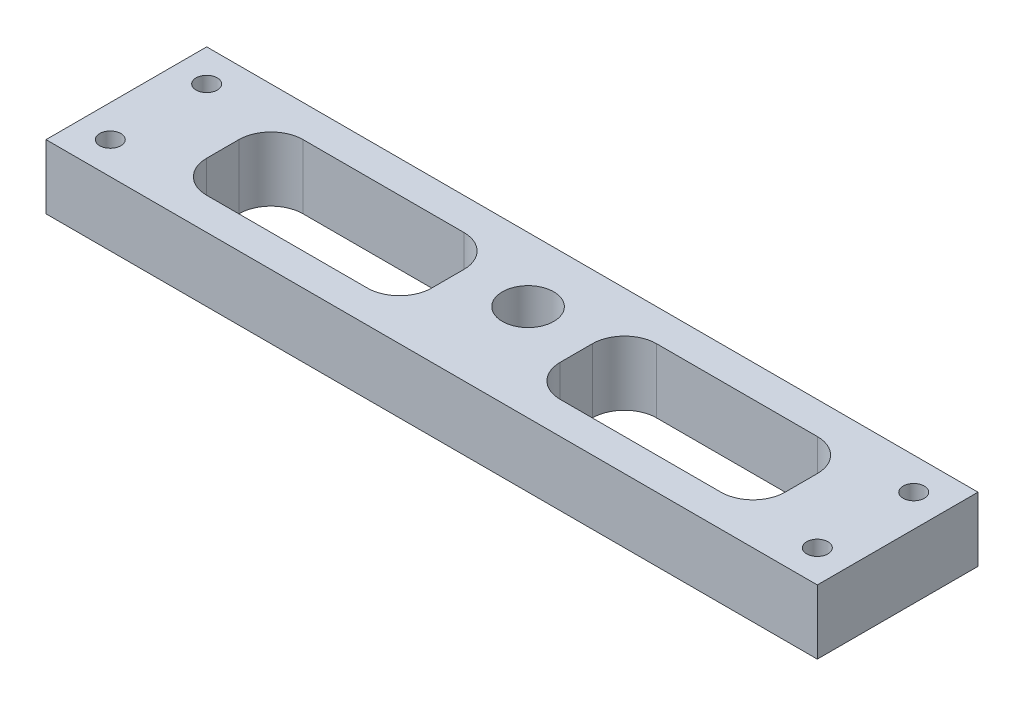
ISO-10303-21;
HEADER;
FILE_DESCRIPTION(('STEP AP214'),'2;1');
FILE_NAME('part.step','',(''),(''),'','','');
FILE_SCHEMA(('AUTOMOTIVE_DESIGN { 1 0 10303 214 1 1 1 1 }'));
ENDSEC;
DATA;
#1=APPLICATION_CONTEXT('core data for automotive mechanical design processes');
#2=APPLICATION_PROTOCOL_DEFINITION('international standard','automotive_design',2000,#1);
#3=PRODUCT_CONTEXT('',#1,'mechanical');
#4=PRODUCT('Part','Part','',(#3));
#5=PRODUCT_RELATED_PRODUCT_CATEGORY('part','',(#4));
#6=PRODUCT_DEFINITION_FORMATION('','',#4);
#7=PRODUCT_DEFINITION_CONTEXT('part definition',#1,'design');
#8=PRODUCT_DEFINITION('design','',#6,#7);
#9=PRODUCT_DEFINITION_SHAPE('','',#8);
#10=(LENGTH_UNIT() NAMED_UNIT(*) SI_UNIT(.MILLI.,.METRE.));
#11=(NAMED_UNIT(*) PLANE_ANGLE_UNIT() SI_UNIT($,.RADIAN.));
#12=(NAMED_UNIT(*) SI_UNIT($,.STERADIAN.) SOLID_ANGLE_UNIT());
#13=UNCERTAINTY_MEASURE_WITH_UNIT(LENGTH_MEASURE(1.E-05),#10,'distance_accuracy_value','');
#14=(GEOMETRIC_REPRESENTATION_CONTEXT(3) GLOBAL_UNCERTAINTY_ASSIGNED_CONTEXT((#13)) GLOBAL_UNIT_ASSIGNED_CONTEXT((#10,
#11,#12)) REPRESENTATION_CONTEXT('',''));
#15=CARTESIAN_POINT('',(0.,0.,0.));
#16=DIRECTION('',(0.,0.,1.));
#17=DIRECTION('',(1.,0.,0.));
#18=AXIS2_PLACEMENT_3D('',#15,#16,#17);
#19=CARTESIAN_POINT('',(0.,10.,0.));
#20=DIRECTION('',(0.,-1.,0.));
#21=DIRECTION('',(0.,0.,-1.));
#22=AXIS2_PLACEMENT_3D('',#19,#20,#21);
#23=PLANE('',#22);
#24=CARTESIAN_POINT('',(-115.,10.,5.00000000000002));
#25=DIRECTION('',(0.,1.,0.));
#26=DIRECTION('',(0.,0.,1.));
#27=AXIS2_PLACEMENT_3D('',#24,#25,#26);
#28=CIRCLE('',#27,1.64999999999998);
#29=CARTESIAN_POINT('',(-115.,10.,6.65000000000001));
#30=VERTEX_POINT('',#29);
#31=EDGE_CURVE('E434',#30,#30,#28,.T.);
#32=ORIENTED_EDGE('',*,*,#31,.F.);
#33=EDGE_LOOP('',(#32));
#34=FACE_BOUND('',#33,.T.);
#35=CARTESIAN_POINT('',(-115.,10.,20.0000000046907));
#36=DIRECTION('',(0.,1.,0.));
#37=DIRECTION('',(0.,0.,1.));
#38=AXIS2_PLACEMENT_3D('',#35,#36,#37);
#39=CIRCLE('',#38,1.64999999999998);
#40=CARTESIAN_POINT('',(-115.,10.,21.6500000046906));
#41=VERTEX_POINT('',#40);
#42=EDGE_CURVE('E436',#41,#41,#39,.T.);
#43=ORIENTED_EDGE('',*,*,#42,.F.);
#44=EDGE_LOOP('',(#43));
#45=FACE_BOUND('',#44,.T.);
#46=CARTESIAN_POINT('',(-5.,10.,5.));
#47=DIRECTION('',(0.,1.,0.));
#48=DIRECTION('',(0.,0.,1.));
#49=AXIS2_PLACEMENT_3D('',#46,#47,#48);
#50=CIRCLE('',#49,1.64999999999999);
#51=CARTESIAN_POINT('',(-5.,10.,6.64999999999999));
#52=VERTEX_POINT('',#51);
#53=EDGE_CURVE('E444',#52,#52,#50,.T.);
#54=ORIENTED_EDGE('',*,*,#53,.F.);
#55=EDGE_LOOP('',(#54));
#56=FACE_BOUND('',#55,.T.);
#57=DIRECTION('',(0.,0.,-1.));
#58=VECTOR('',#57,1.);
#59=CARTESIAN_POINT('',(-14.9999999843242,10.,5.00000000000001));
#60=LINE('',#59,#58);
#61=CARTESIAN_POINT('',(-14.9999999843242,10.,15.0000000046907));
#62=VERTEX_POINT('',#61);
#63=CARTESIAN_POINT('',(-14.9999999843242,10.,10.));
#64=VERTEX_POINT('',#63);
#65=EDGE_CURVE('E312',#62,#64,#60,.T.);
#66=ORIENTED_EDGE('',*,*,#65,.F.);
#67=CARTESIAN_POINT('',(-19.9999999843242,10.,15.0000000046907));
#68=DIRECTION('',(0.,-1.,0.));
#69=DIRECTION('',(0.,0.,-1.));
#70=AXIS2_PLACEMENT_3D('',#67,#68,#69);
#71=CIRCLE('',#70,5.);
#72=CARTESIAN_POINT('',(-19.9999999843242,10.,20.0000000046907));
#73=VERTEX_POINT('',#72);
#74=EDGE_CURVE('E246',#62,#73,#71,.T.);
#75=ORIENTED_EDGE('',*,*,#74,.T.);
#76=DIRECTION('',(1.,0.,0.));
#77=VECTOR('',#76,1.);
#78=CARTESIAN_POINT('',(-14.9999999843242,10.,20.0000000046907));
#79=LINE('',#78,#77);
#80=CARTESIAN_POINT('',(-45.,10.,20.0000000046907));
#81=VERTEX_POINT('',#80);
#82=EDGE_CURVE('E322',#81,#73,#79,.T.);
#83=ORIENTED_EDGE('',*,*,#82,.F.);
#84=CARTESIAN_POINT('',(-45.,10.,15.0000000046907));
#85=DIRECTION('',(0.,-1.,0.));
#86=DIRECTION('',(0.,0.,-1.));
#87=AXIS2_PLACEMENT_3D('',#84,#85,#86);
#88=CIRCLE('',#87,5.);
#89=CARTESIAN_POINT('',(-50.,10.,15.0000000046907));
#90=VERTEX_POINT('',#89);
#91=EDGE_CURVE('E254',#81,#90,#88,.T.);
#92=ORIENTED_EDGE('',*,*,#91,.T.);
#93=DIRECTION('',(0.,0.,1.));
#94=VECTOR('',#93,1.);
#95=CARTESIAN_POINT('',(-50.,10.,5.00000000000002));
#96=LINE('',#95,#94);
#97=CARTESIAN_POINT('',(-50.,10.,10.));
#98=VERTEX_POINT('',#97);
#99=EDGE_CURVE('E319',#98,#90,#96,.T.);
#100=ORIENTED_EDGE('',*,*,#99,.F.);
#101=CARTESIAN_POINT('',(-45.,10.,10.));
#102=DIRECTION('',(0.,-1.,0.));
#103=DIRECTION('',(0.,0.,-1.));
#104=AXIS2_PLACEMENT_3D('',#101,#102,#103);
#105=CIRCLE('',#104,5.);
#106=CARTESIAN_POINT('',(-45.,10.,5.00000000000002));
#107=VERTEX_POINT('',#106);
#108=EDGE_CURVE('E258',#98,#107,#105,.T.);
#109=ORIENTED_EDGE('',*,*,#108,.T.);
#110=DIRECTION('',(-1.,0.,0.));
#111=VECTOR('',#110,1.);
#112=CARTESIAN_POINT('',(-14.9999999843242,10.,5.00000000000001));
#113=LINE('',#112,#111);
#114=CARTESIAN_POINT('',(-19.9999999843242,10.,5.00000000000001));
#115=VERTEX_POINT('',#114);
#116=EDGE_CURVE('E315',#115,#107,#113,.T.);
#117=ORIENTED_EDGE('',*,*,#116,.F.);
#118=CARTESIAN_POINT('',(-19.9999999843242,10.,10.));
#119=DIRECTION('',(0.,-1.,0.));
#120=DIRECTION('',(0.,0.,-1.));
#121=AXIS2_PLACEMENT_3D('',#118,#119,#120);
#122=CIRCLE('',#121,5.);
#123=EDGE_CURVE('E250',#115,#64,#122,.T.);
#124=ORIENTED_EDGE('',*,*,#123,.T.);
#125=EDGE_LOOP('',(#66,#75,#83,#92,#100,#109,#117,#124));
#126=FACE_BOUND('',#125,.T.);
#127=DIRECTION('',(0.,0.,-1.));
#128=VECTOR('',#127,1.);
#129=CARTESIAN_POINT('',(0.,10.,0.));
#130=LINE('',#129,#128);
#131=CARTESIAN_POINT('',(0.,10.,25.0000000046907));
#132=VERTEX_POINT('',#131);
#133=CARTESIAN_POINT('',(0.,10.,0.));
#134=VERTEX_POINT('',#133);
#135=EDGE_CURVE('E186',#132,#134,#130,.T.);
#136=ORIENTED_EDGE('',*,*,#135,.T.);
#137=DIRECTION('',(-1.,0.,0.));
#138=VECTOR('',#137,1.);
#139=CARTESIAN_POINT('',(0.,10.,0.));
#140=LINE('',#139,#138);
#141=CARTESIAN_POINT('',(-119.999999984324,10.,0.));
#142=VERTEX_POINT('',#141);
#143=EDGE_CURVE('E175',#134,#142,#140,.T.);
#144=ORIENTED_EDGE('',*,*,#143,.T.);
#145=DIRECTION('',(0.,0.,1.));
#146=VECTOR('',#145,1.);
#147=CARTESIAN_POINT('',(-119.999999984324,10.,0.));
#148=LINE('',#147,#146);
#149=CARTESIAN_POINT('',(-119.999999984324,10.,25.0000000046907));
#150=VERTEX_POINT('',#149);
#151=EDGE_CURVE('E185',#142,#150,#148,.T.);
#152=ORIENTED_EDGE('',*,*,#151,.T.);
#153=DIRECTION('',(1.,0.,0.));
#154=VECTOR('',#153,1.);
#155=CARTESIAN_POINT('',(0.,10.,25.0000000046907));
#156=LINE('',#155,#154);
#157=EDGE_CURVE('E191',#150,#132,#156,.T.);
#158=ORIENTED_EDGE('',*,*,#157,.T.);
#159=EDGE_LOOP('',(#136,#144,#152,#158));
#160=FACE_BOUND('',#159,.T.);
#161=CARTESIAN_POINT('',(-60.,10.,9.99999999999999));
#162=DIRECTION('',(0.,1.,0.));
#163=DIRECTION('',(0.,0.,1.));
#164=AXIS2_PLACEMENT_3D('',#161,#162,#163);
#165=CIRCLE('',#164,4.);
#166=CARTESIAN_POINT('',(-60.,10.,14.));
#167=VERTEX_POINT('',#166);
#168=EDGE_CURVE('E336',#167,#167,#165,.T.);
#169=ORIENTED_EDGE('',*,*,#168,.F.);
#170=EDGE_LOOP('',(#169));
#171=FACE_BOUND('',#170,.T.);
#172=DIRECTION('',(0.,0.,1.));
#173=VECTOR('',#172,1.);
#174=CARTESIAN_POINT('',(-104.999999984324,10.,5.00000000000001));
#175=LINE('',#174,#173);
#176=CARTESIAN_POINT('',(-104.999999984324,10.,10.));
#177=VERTEX_POINT('',#176);
#178=CARTESIAN_POINT('',(-104.999999984324,10.,15.0000000046907));
#179=VERTEX_POINT('',#178);
#180=EDGE_CURVE('E294',#177,#179,#175,.T.);
#181=ORIENTED_EDGE('',*,*,#180,.F.);
#182=CARTESIAN_POINT('',(-99.9999999843241,10.,10.));
#183=DIRECTION('',(0.,-1.,0.));
#184=DIRECTION('',(0.,0.,-1.));
#185=AXIS2_PLACEMENT_3D('',#182,#183,#184);
#186=CIRCLE('',#185,5.);
#187=CARTESIAN_POINT('',(-99.9999999843241,10.,5.00000000000001));
#188=VERTEX_POINT('',#187);
#189=EDGE_CURVE('E262',#177,#188,#186,.T.);
#190=ORIENTED_EDGE('',*,*,#189,.T.);
#191=DIRECTION('',(-1.,0.,0.));
#192=VECTOR('',#191,1.);
#193=CARTESIAN_POINT('',(-104.999999984324,10.,5.00000000000001));
#194=LINE('',#193,#192);
#195=CARTESIAN_POINT('',(-75.,10.,5.00000000000001));
#196=VERTEX_POINT('',#195);
#197=EDGE_CURVE('E296',#196,#188,#194,.T.);
#198=ORIENTED_EDGE('',*,*,#197,.F.);
#199=CARTESIAN_POINT('',(-75.,10.,10.));
#200=DIRECTION('',(0.,-1.,0.));
#201=DIRECTION('',(0.,0.,-1.));
#202=AXIS2_PLACEMENT_3D('',#199,#200,#201);
#203=CIRCLE('',#202,5.);
#204=CARTESIAN_POINT('',(-70.,10.,10.));
#205=VERTEX_POINT('',#204);
#206=EDGE_CURVE('E52',#196,#205,#203,.T.);
#207=ORIENTED_EDGE('',*,*,#206,.T.);
#208=DIRECTION('',(0.,0.,-1.));
#209=VECTOR('',#208,1.);
#210=CARTESIAN_POINT('',(-70.,10.,5.00000000000001));
#211=LINE('',#210,#209);
#212=CARTESIAN_POINT('',(-70.,10.,15.0000000046907));
#213=VERTEX_POINT('',#212);
#214=EDGE_CURVE('E290',#213,#205,#211,.T.);
#215=ORIENTED_EDGE('',*,*,#214,.F.);
#216=CARTESIAN_POINT('',(-75.,10.,15.0000000046907));
#217=DIRECTION('',(0.,-1.,0.));
#218=DIRECTION('',(0.,0.,-1.));
#219=AXIS2_PLACEMENT_3D('',#216,#217,#218);
#220=CIRCLE('',#219,5.);
#221=CARTESIAN_POINT('',(-75.,10.,20.0000000046907));
#222=VERTEX_POINT('',#221);
#223=EDGE_CURVE('E11',#213,#222,#220,.T.);
#224=ORIENTED_EDGE('',*,*,#223,.T.);
#225=DIRECTION('',(1.,0.,0.));
#226=VECTOR('',#225,1.);
#227=CARTESIAN_POINT('',(-104.999999984324,10.,20.0000000046907));
#228=LINE('',#227,#226);
#229=CARTESIAN_POINT('',(-99.9999999843241,10.,20.0000000046907));
#230=VERTEX_POINT('',#229);
#231=EDGE_CURVE('E288',#230,#222,#228,.T.);
#232=ORIENTED_EDGE('',*,*,#231,.F.);
#233=CARTESIAN_POINT('',(-99.9999999843241,10.,15.0000000046907));
#234=DIRECTION('',(0.,-1.,0.));
#235=DIRECTION('',(0.,0.,-1.));
#236=AXIS2_PLACEMENT_3D('',#233,#234,#235);
#237=CIRCLE('',#236,5.);
#238=EDGE_CURVE('E266',#230,#179,#237,.T.);
#239=ORIENTED_EDGE('',*,*,#238,.T.);
#240=EDGE_LOOP('',(#181,#190,#198,#207,#215,#224,#232,#239));
#241=FACE_BOUND('',#240,.T.);
#242=CARTESIAN_POINT('',(-5.,10.,20.0000000046907));
#243=DIRECTION('',(0.,1.,0.));
#244=DIRECTION('',(0.,0.,1.));
#245=AXIS2_PLACEMENT_3D('',#242,#243,#244);
#246=CIRCLE('',#245,1.64999999999999);
#247=CARTESIAN_POINT('',(-5.,10.,21.6500000046907));
#248=VERTEX_POINT('',#247);
#249=EDGE_CURVE('E450',#248,#248,#246,.T.);
#250=ORIENTED_EDGE('',*,*,#249,.F.);
#251=EDGE_LOOP('',(#250));
#252=FACE_BOUND('',#251,.T.);
#253=ADVANCED_FACE('F37',(#34,#45,#56,#126,#160,#171,#241,#252),#23,.F.);
#254=CARTESIAN_POINT('',(0.,0.,0.));
#255=DIRECTION('',(0.,-1.,0.));
#256=DIRECTION('',(0.,0.,-1.));
#257=AXIS2_PLACEMENT_3D('',#254,#255,#256);
#258=PLANE('',#257);
#259=CARTESIAN_POINT('',(-115.,0.,5.00000000000002));
#260=DIRECTION('',(0.,1.,0.));
#261=DIRECTION('',(0.,0.,1.));
#262=AXIS2_PLACEMENT_3D('',#259,#260,#261);
#263=CIRCLE('',#262,1.65);
#264=CARTESIAN_POINT('',(-115.,0.,6.65000000000002));
#265=VERTEX_POINT('',#264);
#266=EDGE_CURVE('E432',#265,#265,#263,.T.);
#267=ORIENTED_EDGE('',*,*,#266,.T.);
#268=EDGE_LOOP('',(#267));
#269=FACE_BOUND('',#268,.T.);
#270=CARTESIAN_POINT('',(-115.,0.,20.0000000046907));
#271=DIRECTION('',(0.,1.,0.));
#272=DIRECTION('',(0.,0.,1.));
#273=AXIS2_PLACEMENT_3D('',#270,#271,#272);
#274=CIRCLE('',#273,1.65);
#275=CARTESIAN_POINT('',(-115.,0.,21.6500000046907));
#276=VERTEX_POINT('',#275);
#277=EDGE_CURVE('E441',#276,#276,#274,.T.);
#278=ORIENTED_EDGE('',*,*,#277,.T.);
#279=EDGE_LOOP('',(#278));
#280=FACE_BOUND('',#279,.T.);
#281=CARTESIAN_POINT('',(-5.,0.,5.));
#282=DIRECTION('',(0.,1.,0.));
#283=DIRECTION('',(0.,0.,1.));
#284=AXIS2_PLACEMENT_3D('',#281,#282,#283);
#285=CIRCLE('',#284,1.65);
#286=CARTESIAN_POINT('',(-5.,0.,6.65));
#287=VERTEX_POINT('',#286);
#288=EDGE_CURVE('E447',#287,#287,#285,.T.);
#289=ORIENTED_EDGE('',*,*,#288,.T.);
#290=EDGE_LOOP('',(#289));
#291=FACE_BOUND('',#290,.T.);
#292=CARTESIAN_POINT('',(-5.,0.,20.0000000046907));
#293=DIRECTION('',(0.,1.,0.));
#294=DIRECTION('',(0.,0.,1.));
#295=AXIS2_PLACEMENT_3D('',#292,#293,#294);
#296=CIRCLE('',#295,1.65);
#297=CARTESIAN_POINT('',(-5.,0.,21.6500000046907));
#298=VERTEX_POINT('',#297);
#299=EDGE_CURVE('E308',#298,#298,#296,.T.);
#300=ORIENTED_EDGE('',*,*,#299,.T.);
#301=EDGE_LOOP('',(#300));
#302=FACE_BOUND('',#301,.T.);
#303=DIRECTION('',(0.,0.,-1.));
#304=VECTOR('',#303,1.);
#305=CARTESIAN_POINT('',(0.,0.,0.));
#306=LINE('',#305,#304);
#307=CARTESIAN_POINT('',(0.,0.,25.0000000046907));
#308=VERTEX_POINT('',#307);
#309=CARTESIAN_POINT('',(0.,0.,0.));
#310=VERTEX_POINT('',#309);
#311=EDGE_CURVE('E199',#308,#310,#306,.T.);
#312=ORIENTED_EDGE('',*,*,#311,.F.);
#313=DIRECTION('',(1.,0.,0.));
#314=VECTOR('',#313,1.);
#315=CARTESIAN_POINT('',(0.,0.,25.0000000046907));
#316=LINE('',#315,#314);
#317=CARTESIAN_POINT('',(-119.999999984324,0.,25.0000000046907));
#318=VERTEX_POINT('',#317);
#319=EDGE_CURVE('E195',#318,#308,#316,.T.);
#320=ORIENTED_EDGE('',*,*,#319,.F.);
#321=DIRECTION('',(0.,0.,1.));
#322=VECTOR('',#321,1.);
#323=CARTESIAN_POINT('',(-119.999999984324,0.,0.));
#324=LINE('',#323,#322);
#325=CARTESIAN_POINT('',(-119.999999984324,0.,0.));
#326=VERTEX_POINT('',#325);
#327=EDGE_CURVE('E347',#326,#318,#324,.T.);
#328=ORIENTED_EDGE('',*,*,#327,.F.);
#329=DIRECTION('',(-1.,0.,0.));
#330=VECTOR('',#329,1.);
#331=CARTESIAN_POINT('',(0.,0.,0.));
#332=LINE('',#331,#330);
#333=EDGE_CURVE('E345',#310,#326,#332,.T.);
#334=ORIENTED_EDGE('',*,*,#333,.F.);
#335=EDGE_LOOP('',(#312,#320,#328,#334));
#336=FACE_BOUND('',#335,.T.);
#337=CARTESIAN_POINT('',(-60.,0.,9.99999999999999));
#338=DIRECTION('',(0.,1.,0.));
#339=DIRECTION('',(0.,0.,1.));
#340=AXIS2_PLACEMENT_3D('',#337,#338,#339);
#341=CIRCLE('',#340,4.);
#342=CARTESIAN_POINT('',(-60.,0.,14.));
#343=VERTEX_POINT('',#342);
#344=EDGE_CURVE('E325',#343,#343,#341,.T.);
#345=ORIENTED_EDGE('',*,*,#344,.T.);
#346=EDGE_LOOP('',(#345));
#347=FACE_BOUND('',#346,.T.);
#348=DIRECTION('',(0.,0.,1.));
#349=VECTOR('',#348,1.);
#350=CARTESIAN_POINT('',(-50.,0.,5.00000000000002));
#351=LINE('',#350,#349);
#352=CARTESIAN_POINT('',(-50.,0.,10.));
#353=VERTEX_POINT('',#352);
#354=CARTESIAN_POINT('',(-50.,0.,15.0000000046907));
#355=VERTEX_POINT('',#354);
#356=EDGE_CURVE('E331',#353,#355,#351,.T.);
#357=ORIENTED_EDGE('',*,*,#356,.T.);
#358=CARTESIAN_POINT('',(-45.,0.,15.0000000046907));
#359=DIRECTION('',(0.,-1.,0.));
#360=DIRECTION('',(0.,0.,-1.));
#361=AXIS2_PLACEMENT_3D('',#358,#359,#360);
#362=CIRCLE('',#361,5.);
#363=CARTESIAN_POINT('',(-45.,0.,20.0000000046907));
#364=VERTEX_POINT('',#363);
#365=EDGE_CURVE('E252',#355,#364,#362,.F.);
#366=ORIENTED_EDGE('',*,*,#365,.T.);
#367=DIRECTION('',(1.,0.,0.));
#368=VECTOR('',#367,1.);
#369=CARTESIAN_POINT('',(-14.9999999843242,0.,20.0000000046907));
#370=LINE('',#369,#368);
#371=CARTESIAN_POINT('',(-19.9999999843242,0.,20.0000000046907));
#372=VERTEX_POINT('',#371);
#373=EDGE_CURVE('E316',#364,#372,#370,.T.);
#374=ORIENTED_EDGE('',*,*,#373,.T.);
#375=CARTESIAN_POINT('',(-19.9999999843242,0.,15.0000000046907));
#376=DIRECTION('',(0.,-1.,0.));
#377=DIRECTION('',(0.,0.,-1.));
#378=AXIS2_PLACEMENT_3D('',#375,#376,#377);
#379=CIRCLE('',#378,5.);
#380=CARTESIAN_POINT('',(-14.9999999843242,0.,15.0000000046907));
#381=VERTEX_POINT('',#380);
#382=EDGE_CURVE('E244',#372,#381,#379,.F.);
#383=ORIENTED_EDGE('',*,*,#382,.T.);
#384=DIRECTION('',(0.,0.,-1.));
#385=VECTOR('',#384,1.);
#386=CARTESIAN_POINT('',(-14.9999999843242,0.,5.00000000000001));
#387=LINE('',#386,#385);
#388=CARTESIAN_POINT('',(-14.9999999843242,0.,10.));
#389=VERTEX_POINT('',#388);
#390=EDGE_CURVE('E304',#381,#389,#387,.T.);
#391=ORIENTED_EDGE('',*,*,#390,.T.);
#392=CARTESIAN_POINT('',(-19.9999999843242,0.,10.));
#393=DIRECTION('',(0.,-1.,0.));
#394=DIRECTION('',(0.,0.,-1.));
#395=AXIS2_PLACEMENT_3D('',#392,#393,#394);
#396=CIRCLE('',#395,5.);
#397=CARTESIAN_POINT('',(-19.9999999843242,0.,5.00000000000001));
#398=VERTEX_POINT('',#397);
#399=EDGE_CURVE('E248',#389,#398,#396,.F.);
#400=ORIENTED_EDGE('',*,*,#399,.T.);
#401=DIRECTION('',(-1.,0.,0.));
#402=VECTOR('',#401,1.);
#403=CARTESIAN_POINT('',(-14.9999999843242,0.,5.00000000000001));
#404=LINE('',#403,#402);
#405=CARTESIAN_POINT('',(-45.,0.,5.00000000000002));
#406=VERTEX_POINT('',#405);
#407=EDGE_CURVE('E328',#398,#406,#404,.T.);
#408=ORIENTED_EDGE('',*,*,#407,.T.);
#409=CARTESIAN_POINT('',(-45.,0.,10.));
#410=DIRECTION('',(0.,-1.,0.));
#411=DIRECTION('',(0.,0.,-1.));
#412=AXIS2_PLACEMENT_3D('',#409,#410,#411);
#413=CIRCLE('',#412,5.);
#414=EDGE_CURVE('E256',#406,#353,#413,.F.);
#415=ORIENTED_EDGE('',*,*,#414,.T.);
#416=EDGE_LOOP('',(#357,#366,#374,#383,#391,#400,#408,#415));
#417=FACE_BOUND('',#416,.T.);
#418=DIRECTION('',(0.,0.,-1.));
#419=VECTOR('',#418,1.);
#420=CARTESIAN_POINT('',(-70.,0.,5.00000000000001));
#421=LINE('',#420,#419);
#422=CARTESIAN_POINT('',(-70.,0.,15.0000000046907));
#423=VERTEX_POINT('',#422);
#424=CARTESIAN_POINT('',(-70.,0.,10.));
#425=VERTEX_POINT('',#424);
#426=EDGE_CURVE('E274',#423,#425,#421,.T.);
#427=ORIENTED_EDGE('',*,*,#426,.T.);
#428=CARTESIAN_POINT('',(-75.,0.,10.));
#429=DIRECTION('',(0.,-1.,0.));
#430=DIRECTION('',(0.,0.,-1.));
#431=AXIS2_PLACEMENT_3D('',#428,#429,#430);
#432=CIRCLE('',#431,5.);
#433=CARTESIAN_POINT('',(-75.,0.,5.00000000000001));
#434=VERTEX_POINT('',#433);
#435=EDGE_CURVE('E268',#425,#434,#432,.F.);
#436=ORIENTED_EDGE('',*,*,#435,.T.);
#437=DIRECTION('',(-1.,0.,0.));
#438=VECTOR('',#437,1.);
#439=CARTESIAN_POINT('',(-104.999999984324,0.,5.00000000000001));
#440=LINE('',#439,#438);
#441=CARTESIAN_POINT('',(-99.9999999843241,0.,5.00000000000001));
#442=VERTEX_POINT('',#441);
#443=EDGE_CURVE('E281',#434,#442,#440,.T.);
#444=ORIENTED_EDGE('',*,*,#443,.T.);
#445=CARTESIAN_POINT('',(-99.9999999843241,0.,10.));
#446=DIRECTION('',(0.,-1.,0.));
#447=DIRECTION('',(0.,0.,-1.));
#448=AXIS2_PLACEMENT_3D('',#445,#446,#447);
#449=CIRCLE('',#448,5.);
#450=CARTESIAN_POINT('',(-104.999999984324,0.,10.));
#451=VERTEX_POINT('',#450);
#452=EDGE_CURVE('E260',#442,#451,#449,.F.);
#453=ORIENTED_EDGE('',*,*,#452,.T.);
#454=DIRECTION('',(0.,0.,1.));
#455=VECTOR('',#454,1.);
#456=CARTESIAN_POINT('',(-104.999999984324,0.,5.00000000000001));
#457=LINE('',#456,#455);
#458=CARTESIAN_POINT('',(-104.999999984324,0.,15.0000000046907));
#459=VERTEX_POINT('',#458);
#460=EDGE_CURVE('E305',#451,#459,#457,.T.);
#461=ORIENTED_EDGE('',*,*,#460,.T.);
#462=CARTESIAN_POINT('',(-99.9999999843241,0.,15.0000000046907));
#463=DIRECTION('',(0.,-1.,0.));
#464=DIRECTION('',(0.,0.,-1.));
#465=AXIS2_PLACEMENT_3D('',#462,#463,#464);
#466=CIRCLE('',#465,5.);
#467=CARTESIAN_POINT('',(-99.9999999843241,0.,20.0000000046907));
#468=VERTEX_POINT('',#467);
#469=EDGE_CURVE('E264',#459,#468,#466,.F.);
#470=ORIENTED_EDGE('',*,*,#469,.T.);
#471=DIRECTION('',(1.,0.,0.));
#472=VECTOR('',#471,1.);
#473=CARTESIAN_POINT('',(-104.999999984324,0.,20.0000000046907));
#474=LINE('',#473,#472);
#475=CARTESIAN_POINT('',(-75.,0.,20.0000000046907));
#476=VERTEX_POINT('',#475);
#477=EDGE_CURVE('E276',#468,#476,#474,.T.);
#478=ORIENTED_EDGE('',*,*,#477,.T.);
#479=CARTESIAN_POINT('',(-75.,0.,15.0000000046907));
#480=DIRECTION('',(0.,-1.,0.));
#481=DIRECTION('',(0.,0.,-1.));
#482=AXIS2_PLACEMENT_3D('',#479,#480,#481);
#483=CIRCLE('',#482,5.);
#484=EDGE_CURVE('E45',#476,#423,#483,.F.);
#485=ORIENTED_EDGE('',*,*,#484,.T.);
#486=EDGE_LOOP('',(#427,#436,#444,#453,#461,#470,#478,#485));
#487=FACE_BOUND('',#486,.T.);
#488=ADVANCED_FACE('F273',(#269,#280,#291,#302,#336,#347,#417,#487),#258,.T.);
#489=CARTESIAN_POINT('',(0.,10.,0.));
#490=DIRECTION('',(-1.,0.,0.));
#491=DIRECTION('',(0.,0.,1.));
#492=AXIS2_PLACEMENT_3D('',#489,#490,#491);
#493=PLANE('',#492);
#494=ORIENTED_EDGE('',*,*,#311,.T.);
#495=DIRECTION('',(0.,-1.,0.));
#496=VECTOR('',#495,1.);
#497=CARTESIAN_POINT('',(0.,10.,0.));
#498=LINE('',#497,#496);
#499=EDGE_CURVE('E179',#134,#310,#498,.T.);
#500=ORIENTED_EDGE('',*,*,#499,.F.);
#501=ORIENTED_EDGE('',*,*,#135,.F.);
#502=DIRECTION('',(0.,-1.,0.));
#503=VECTOR('',#502,1.);
#504=CARTESIAN_POINT('',(0.,10.,25.0000000046907));
#505=LINE('',#504,#503);
#506=EDGE_CURVE('E343',#132,#308,#505,.T.);
#507=ORIENTED_EDGE('',*,*,#506,.T.);
#508=EDGE_LOOP('',(#494,#500,#501,#507));
#509=FACE_BOUND('',#508,.T.);
#510=ADVANCED_FACE('F197',(#509),#493,.F.);
#511=CARTESIAN_POINT('',(0.,10.,0.));
#512=DIRECTION('',(0.,0.,1.));
#513=DIRECTION('',(1.,0.,0.));
#514=AXIS2_PLACEMENT_3D('',#511,#512,#513);
#515=PLANE('',#514);
#516=ORIENTED_EDGE('',*,*,#333,.T.);
#517=DIRECTION('',(0.,-1.,0.));
#518=VECTOR('',#517,1.);
#519=CARTESIAN_POINT('',(-119.999999984324,10.,0.));
#520=LINE('',#519,#518);
#521=EDGE_CURVE('E182',#142,#326,#520,.T.);
#522=ORIENTED_EDGE('',*,*,#521,.F.);
#523=ORIENTED_EDGE('',*,*,#143,.F.);
#524=ORIENTED_EDGE('',*,*,#499,.T.);
#525=EDGE_LOOP('',(#516,#522,#523,#524));
#526=FACE_BOUND('',#525,.T.);
#527=ADVANCED_FACE('F177',(#526),#515,.F.);
#528=CARTESIAN_POINT('',(-119.999999984324,10.,0.));
#529=DIRECTION('',(1.,0.,0.));
#530=DIRECTION('',(0.,0.,-1.));
#531=AXIS2_PLACEMENT_3D('',#528,#529,#530);
#532=PLANE('',#531);
#533=ORIENTED_EDGE('',*,*,#327,.T.);
#534=DIRECTION('',(0.,-1.,0.));
#535=VECTOR('',#534,1.);
#536=CARTESIAN_POINT('',(-119.999999984324,10.,25.0000000046907));
#537=LINE('',#536,#535);
#538=EDGE_CURVE('E204',#150,#318,#537,.T.);
#539=ORIENTED_EDGE('',*,*,#538,.F.);
#540=ORIENTED_EDGE('',*,*,#151,.F.);
#541=ORIENTED_EDGE('',*,*,#521,.T.);
#542=EDGE_LOOP('',(#533,#539,#540,#541));
#543=FACE_BOUND('',#542,.T.);
#544=ADVANCED_FACE('F359',(#543),#532,.F.);
#545=CARTESIAN_POINT('',(0.,10.,25.0000000046907));
#546=DIRECTION('',(0.,0.,-1.));
#547=DIRECTION('',(-1.,0.,0.));
#548=AXIS2_PLACEMENT_3D('',#545,#546,#547);
#549=PLANE('',#548);
#550=ORIENTED_EDGE('',*,*,#319,.T.);
#551=ORIENTED_EDGE('',*,*,#506,.F.);
#552=ORIENTED_EDGE('',*,*,#157,.F.);
#553=ORIENTED_EDGE('',*,*,#538,.T.);
#554=EDGE_LOOP('',(#550,#551,#552,#553));
#555=FACE_BOUND('',#554,.T.);
#556=ADVANCED_FACE('F354',(#555),#549,.F.);
#557=CARTESIAN_POINT('',(-60.,10.,9.99999999999999));
#558=DIRECTION('',(0.,-1.,0.));
#559=DIRECTION('',(0.,0.,-1.));
#560=AXIS2_PLACEMENT_3D('',#557,#558,#559);
#561=CYLINDRICAL_SURFACE('',#560,4.);
#562=ORIENTED_EDGE('',*,*,#168,.T.);
#563=EDGE_LOOP('',(#562));
#564=FACE_BOUND('',#563,.T.);
#565=ORIENTED_EDGE('',*,*,#344,.F.);
#566=EDGE_LOOP('',(#565));
#567=FACE_BOUND('',#566,.T.);
#568=ADVANCED_FACE('F366',(#564,#567),#561,.F.);
#569=CARTESIAN_POINT('',(-14.9999999843242,10.,5.00000000000001));
#570=DIRECTION('',(-1.,0.,0.));
#571=DIRECTION('',(0.,0.,1.));
#572=AXIS2_PLACEMENT_3D('',#569,#570,#571);
#573=PLANE('',#572);
#574=ORIENTED_EDGE('',*,*,#390,.F.);
#575=DIRECTION('',(0.,-1.,0.));
#576=VECTOR('',#575,1.);
#577=CARTESIAN_POINT('',(-14.9999999843242,10.,15.0000000046907));
#578=LINE('',#577,#576);
#579=EDGE_CURVE('E213',#381,#62,#578,.F.);
#580=ORIENTED_EDGE('',*,*,#579,.T.);
#581=ORIENTED_EDGE('',*,*,#65,.T.);
#582=DIRECTION('',(0.,-1.,0.));
#583=VECTOR('',#582,1.);
#584=CARTESIAN_POINT('',(-14.9999999843242,0.,10.));
#585=LINE('',#584,#583);
#586=EDGE_CURVE('E210',#64,#389,#585,.T.);
#587=ORIENTED_EDGE('',*,*,#586,.T.);
#588=EDGE_LOOP('',(#574,#580,#581,#587));
#589=FACE_BOUND('',#588,.T.);
#590=ADVANCED_FACE('F382',(#589),#573,.T.);
#591=CARTESIAN_POINT('',(-14.9999999843242,10.,5.00000000000001));
#592=DIRECTION('',(0.,0.,1.));
#593=DIRECTION('',(1.,0.,0.));
#594=AXIS2_PLACEMENT_3D('',#591,#592,#593);
#595=PLANE('',#594);
#596=ORIENTED_EDGE('',*,*,#407,.F.);
#597=DIRECTION('',(0.,-1.,0.));
#598=VECTOR('',#597,1.);
#599=CARTESIAN_POINT('',(-19.9999999843242,10.,5.00000000000001));
#600=LINE('',#599,#598);
#601=EDGE_CURVE('E218',#398,#115,#600,.F.);
#602=ORIENTED_EDGE('',*,*,#601,.T.);
#603=ORIENTED_EDGE('',*,*,#116,.T.);
#604=DIRECTION('',(0.,-1.,0.));
#605=VECTOR('',#604,1.);
#606=CARTESIAN_POINT('',(-45.,0.,5.00000000000002));
#607=LINE('',#606,#605);
#608=EDGE_CURVE('E215',#107,#406,#607,.T.);
#609=ORIENTED_EDGE('',*,*,#608,.T.);
#610=EDGE_LOOP('',(#596,#602,#603,#609));
#611=FACE_BOUND('',#610,.T.);
#612=ADVANCED_FACE('F386',(#611),#595,.T.);
#613=CARTESIAN_POINT('',(-50.,10.,5.00000000000002));
#614=DIRECTION('',(1.,0.,0.));
#615=DIRECTION('',(0.,0.,-1.));
#616=AXIS2_PLACEMENT_3D('',#613,#614,#615);
#617=PLANE('',#616);
#618=ORIENTED_EDGE('',*,*,#99,.T.);
#619=DIRECTION('',(0.,-1.,0.));
#620=VECTOR('',#619,1.);
#621=CARTESIAN_POINT('',(-50.,0.,15.0000000046907));
#622=LINE('',#621,#620);
#623=EDGE_CURVE('E222',#90,#355,#622,.T.);
#624=ORIENTED_EDGE('',*,*,#623,.T.);
#625=ORIENTED_EDGE('',*,*,#356,.F.);
#626=DIRECTION('',(0.,-1.,0.));
#627=VECTOR('',#626,1.);
#628=CARTESIAN_POINT('',(-50.,10.,10.));
#629=LINE('',#628,#627);
#630=EDGE_CURVE('E220',#353,#98,#629,.F.);
#631=ORIENTED_EDGE('',*,*,#630,.T.);
#632=EDGE_LOOP('',(#618,#624,#625,#631));
#633=FACE_BOUND('',#632,.T.);
#634=ADVANCED_FACE('F390',(#633),#617,.T.);
#635=CARTESIAN_POINT('',(-14.9999999843242,10.,20.0000000046907));
#636=DIRECTION('',(0.,0.,-1.));
#637=DIRECTION('',(-1.,0.,0.));
#638=AXIS2_PLACEMENT_3D('',#635,#636,#637);
#639=PLANE('',#638);
#640=ORIENTED_EDGE('',*,*,#82,.T.);
#641=DIRECTION('',(0.,-1.,0.));
#642=VECTOR('',#641,1.);
#643=CARTESIAN_POINT('',(-19.9999999843242,0.,20.0000000046907));
#644=LINE('',#643,#642);
#645=EDGE_CURVE('E202',#73,#372,#644,.T.);
#646=ORIENTED_EDGE('',*,*,#645,.T.);
#647=ORIENTED_EDGE('',*,*,#373,.F.);
#648=DIRECTION('',(0.,-1.,0.));
#649=VECTOR('',#648,1.);
#650=CARTESIAN_POINT('',(-45.,10.,20.0000000046907));
#651=LINE('',#650,#649);
#652=EDGE_CURVE('E200',#364,#81,#651,.F.);
#653=ORIENTED_EDGE('',*,*,#652,.T.);
#654=EDGE_LOOP('',(#640,#646,#647,#653));
#655=FACE_BOUND('',#654,.T.);
#656=ADVANCED_FACE('F394',(#655),#639,.T.);
#657=CARTESIAN_POINT('',(-104.999999984324,10.,5.00000000000001));
#658=DIRECTION('',(1.,0.,0.));
#659=DIRECTION('',(0.,0.,-1.));
#660=AXIS2_PLACEMENT_3D('',#657,#658,#659);
#661=PLANE('',#660);
#662=ORIENTED_EDGE('',*,*,#460,.F.);
#663=DIRECTION('',(0.,-1.,0.));
#664=VECTOR('',#663,1.);
#665=CARTESIAN_POINT('',(-104.999999984324,10.,10.));
#666=LINE('',#665,#664);
#667=EDGE_CURVE('E233',#451,#177,#666,.F.);
#668=ORIENTED_EDGE('',*,*,#667,.T.);
#669=ORIENTED_EDGE('',*,*,#180,.T.);
#670=DIRECTION('',(0.,-1.,0.));
#671=VECTOR('',#670,1.);
#672=CARTESIAN_POINT('',(-104.999999984324,0.,15.0000000046907));
#673=LINE('',#672,#671);
#674=EDGE_CURVE('E230',#179,#459,#673,.T.);
#675=ORIENTED_EDGE('',*,*,#674,.T.);
#676=EDGE_LOOP('',(#662,#668,#669,#675));
#677=FACE_BOUND('',#676,.T.);
#678=ADVANCED_FACE('F398',(#677),#661,.T.);
#679=CARTESIAN_POINT('',(-104.999999984324,10.,20.0000000046907));
#680=DIRECTION('',(0.,0.,-1.));
#681=DIRECTION('',(-1.,0.,0.));
#682=AXIS2_PLACEMENT_3D('',#679,#680,#681);
#683=PLANE('',#682);
#684=ORIENTED_EDGE('',*,*,#477,.F.);
#685=DIRECTION('',(0.,-1.,0.));
#686=VECTOR('',#685,1.);
#687=CARTESIAN_POINT('',(-99.9999999843241,10.,20.0000000046907));
#688=LINE('',#687,#686);
#689=EDGE_CURVE('E238',#468,#230,#688,.F.);
#690=ORIENTED_EDGE('',*,*,#689,.T.);
#691=ORIENTED_EDGE('',*,*,#231,.T.);
#692=DIRECTION('',(0.,-1.,0.));
#693=VECTOR('',#692,1.);
#694=CARTESIAN_POINT('',(-75.,0.,20.0000000046907));
#695=LINE('',#694,#693);
#696=EDGE_CURVE('E235',#222,#476,#695,.T.);
#697=ORIENTED_EDGE('',*,*,#696,.T.);
#698=EDGE_LOOP('',(#684,#690,#691,#697));
#699=FACE_BOUND('',#698,.T.);
#700=ADVANCED_FACE('F292',(#699),#683,.T.);
#701=CARTESIAN_POINT('',(-70.,10.,5.00000000000001));
#702=DIRECTION('',(-1.,0.,0.));
#703=DIRECTION('',(0.,0.,1.));
#704=AXIS2_PLACEMENT_3D('',#701,#702,#703);
#705=PLANE('',#704);
#706=ORIENTED_EDGE('',*,*,#214,.T.);
#707=DIRECTION('',(0.,-1.,0.));
#708=VECTOR('',#707,1.);
#709=CARTESIAN_POINT('',(-70.,0.,10.));
#710=LINE('',#709,#708);
#711=EDGE_CURVE('E241',#205,#425,#710,.T.);
#712=ORIENTED_EDGE('',*,*,#711,.T.);
#713=ORIENTED_EDGE('',*,*,#426,.F.);
#714=DIRECTION('',(0.,-1.,0.));
#715=VECTOR('',#714,1.);
#716=CARTESIAN_POINT('',(-70.,10.,15.0000000046907));
#717=LINE('',#716,#715);
#718=EDGE_CURVE('E59',#423,#213,#717,.F.);
#719=ORIENTED_EDGE('',*,*,#718,.T.);
#720=EDGE_LOOP('',(#706,#712,#713,#719));
#721=FACE_BOUND('',#720,.T.);
#722=ADVANCED_FACE('F279',(#721),#705,.T.);
#723=CARTESIAN_POINT('',(-104.999999984324,10.,5.00000000000001));
#724=DIRECTION('',(0.,0.,1.));
#725=DIRECTION('',(1.,0.,0.));
#726=AXIS2_PLACEMENT_3D('',#723,#724,#725);
#727=PLANE('',#726);
#728=ORIENTED_EDGE('',*,*,#197,.T.);
#729=DIRECTION('',(0.,-1.,0.));
#730=VECTOR('',#729,1.);
#731=CARTESIAN_POINT('',(-99.9999999843241,0.,5.00000000000001));
#732=LINE('',#731,#730);
#733=EDGE_CURVE('E227',#188,#442,#732,.T.);
#734=ORIENTED_EDGE('',*,*,#733,.T.);
#735=ORIENTED_EDGE('',*,*,#443,.F.);
#736=DIRECTION('',(0.,-1.,0.));
#737=VECTOR('',#736,1.);
#738=CARTESIAN_POINT('',(-75.,10.,5.00000000000001));
#739=LINE('',#738,#737);
#740=EDGE_CURVE('E225',#434,#196,#739,.F.);
#741=ORIENTED_EDGE('',*,*,#740,.T.);
#742=EDGE_LOOP('',(#728,#734,#735,#741));
#743=FACE_BOUND('',#742,.T.);
#744=ADVANCED_FACE('F407',(#743),#727,.T.);
#745=CARTESIAN_POINT('',(-19.9999999843242,10.,15.0000000046907));
#746=DIRECTION('',(0.,1.,0.));
#747=DIRECTION('',(0.,0.,1.));
#748=AXIS2_PLACEMENT_3D('',#745,#746,#747);
#749=CYLINDRICAL_SURFACE('',#748,5.);
#750=ORIENTED_EDGE('',*,*,#74,.F.);
#751=ORIENTED_EDGE('',*,*,#579,.F.);
#752=ORIENTED_EDGE('',*,*,#382,.F.);
#753=ORIENTED_EDGE('',*,*,#645,.F.);
#754=EDGE_LOOP('',(#750,#751,#752,#753));
#755=FACE_BOUND('',#754,.T.);
#756=ADVANCED_FACE('F410',(#755),#749,.F.);
#757=CARTESIAN_POINT('',(-19.9999999843242,10.,10.));
#758=DIRECTION('',(0.,1.,0.));
#759=DIRECTION('',(0.,0.,1.));
#760=AXIS2_PLACEMENT_3D('',#757,#758,#759);
#761=CYLINDRICAL_SURFACE('',#760,5.);
#762=ORIENTED_EDGE('',*,*,#123,.F.);
#763=ORIENTED_EDGE('',*,*,#601,.F.);
#764=ORIENTED_EDGE('',*,*,#399,.F.);
#765=ORIENTED_EDGE('',*,*,#586,.F.);
#766=EDGE_LOOP('',(#762,#763,#764,#765));
#767=FACE_BOUND('',#766,.T.);
#768=ADVANCED_FACE('F490',(#767),#761,.F.);
#769=CARTESIAN_POINT('',(-45.,10.,15.0000000046907));
#770=DIRECTION('',(0.,1.,0.));
#771=DIRECTION('',(0.,0.,1.));
#772=AXIS2_PLACEMENT_3D('',#769,#770,#771);
#773=CYLINDRICAL_SURFACE('',#772,5.);
#774=ORIENTED_EDGE('',*,*,#91,.F.);
#775=ORIENTED_EDGE('',*,*,#652,.F.);
#776=ORIENTED_EDGE('',*,*,#365,.F.);
#777=ORIENTED_EDGE('',*,*,#623,.F.);
#778=EDGE_LOOP('',(#774,#775,#776,#777));
#779=FACE_BOUND('',#778,.T.);
#780=ADVANCED_FACE('F480',(#779),#773,.F.);
#781=CARTESIAN_POINT('',(-45.,10.,10.));
#782=DIRECTION('',(0.,1.,0.));
#783=DIRECTION('',(0.,0.,1.));
#784=AXIS2_PLACEMENT_3D('',#781,#782,#783);
#785=CYLINDRICAL_SURFACE('',#784,5.);
#786=ORIENTED_EDGE('',*,*,#108,.F.);
#787=ORIENTED_EDGE('',*,*,#630,.F.);
#788=ORIENTED_EDGE('',*,*,#414,.F.);
#789=ORIENTED_EDGE('',*,*,#608,.F.);
#790=EDGE_LOOP('',(#786,#787,#788,#789));
#791=FACE_BOUND('',#790,.T.);
#792=ADVANCED_FACE('F486',(#791),#785,.F.);
#793=CARTESIAN_POINT('',(-99.9999999843241,10.,10.));
#794=DIRECTION('',(0.,1.,0.));
#795=DIRECTION('',(0.,0.,1.));
#796=AXIS2_PLACEMENT_3D('',#793,#794,#795);
#797=CYLINDRICAL_SURFACE('',#796,5.);
#798=ORIENTED_EDGE('',*,*,#189,.F.);
#799=ORIENTED_EDGE('',*,*,#667,.F.);
#800=ORIENTED_EDGE('',*,*,#452,.F.);
#801=ORIENTED_EDGE('',*,*,#733,.F.);
#802=EDGE_LOOP('',(#798,#799,#800,#801));
#803=FACE_BOUND('',#802,.T.);
#804=ADVANCED_FACE('F503',(#803),#797,.F.);
#805=CARTESIAN_POINT('',(-99.9999999843241,10.,15.0000000046907));
#806=DIRECTION('',(0.,1.,0.));
#807=DIRECTION('',(0.,0.,1.));
#808=AXIS2_PLACEMENT_3D('',#805,#806,#807);
#809=CYLINDRICAL_SURFACE('',#808,5.);
#810=ORIENTED_EDGE('',*,*,#238,.F.);
#811=ORIENTED_EDGE('',*,*,#689,.F.);
#812=ORIENTED_EDGE('',*,*,#469,.F.);
#813=ORIENTED_EDGE('',*,*,#674,.F.);
#814=EDGE_LOOP('',(#810,#811,#812,#813));
#815=FACE_BOUND('',#814,.T.);
#816=ADVANCED_FACE('F506',(#815),#809,.F.);
#817=CARTESIAN_POINT('',(-75.,10.,10.));
#818=DIRECTION('',(0.,1.,0.));
#819=DIRECTION('',(0.,0.,1.));
#820=AXIS2_PLACEMENT_3D('',#817,#818,#819);
#821=CYLINDRICAL_SURFACE('',#820,5.);
#822=ORIENTED_EDGE('',*,*,#206,.F.);
#823=ORIENTED_EDGE('',*,*,#740,.F.);
#824=ORIENTED_EDGE('',*,*,#435,.F.);
#825=ORIENTED_EDGE('',*,*,#711,.F.);
#826=EDGE_LOOP('',(#822,#823,#824,#825));
#827=FACE_BOUND('',#826,.T.);
#828=ADVANCED_FACE('F509',(#827),#821,.F.);
#829=CARTESIAN_POINT('',(-75.,10.,15.0000000046907));
#830=DIRECTION('',(0.,1.,0.));
#831=DIRECTION('',(0.,0.,1.));
#832=AXIS2_PLACEMENT_3D('',#829,#830,#831);
#833=CYLINDRICAL_SURFACE('',#832,5.);
#834=ORIENTED_EDGE('',*,*,#223,.F.);
#835=ORIENTED_EDGE('',*,*,#718,.F.);
#836=ORIENTED_EDGE('',*,*,#484,.F.);
#837=ORIENTED_EDGE('',*,*,#696,.F.);
#838=EDGE_LOOP('',(#834,#835,#836,#837));
#839=FACE_BOUND('',#838,.T.);
#840=ADVANCED_FACE('F39',(#839),#833,.F.);
#841=CARTESIAN_POINT('',(-5.,10.,20.0000000046907));
#842=DIRECTION('',(0.,1.,0.));
#843=DIRECTION('',(0.,0.,1.));
#844=AXIS2_PLACEMENT_3D('',#841,#842,#843);
#845=CYLINDRICAL_SURFACE('',#844,1.64999999999999);
#846=ORIENTED_EDGE('',*,*,#299,.F.);
#847=EDGE_LOOP('',(#846));
#848=FACE_BOUND('',#847,.T.);
#849=ORIENTED_EDGE('',*,*,#249,.T.);
#850=EDGE_LOOP('',(#849));
#851=FACE_BOUND('',#850,.T.);
#852=ADVANCED_FACE('F412',(#848,#851),#845,.F.);
#853=CARTESIAN_POINT('',(-5.,10.,5.));
#854=DIRECTION('',(0.,1.,0.));
#855=DIRECTION('',(0.,0.,1.));
#856=AXIS2_PLACEMENT_3D('',#853,#854,#855);
#857=CYLINDRICAL_SURFACE('',#856,1.64999999999999);
#858=ORIENTED_EDGE('',*,*,#288,.F.);
#859=EDGE_LOOP('',(#858));
#860=FACE_BOUND('',#859,.T.);
#861=ORIENTED_EDGE('',*,*,#53,.T.);
#862=EDGE_LOOP('',(#861));
#863=FACE_BOUND('',#862,.T.);
#864=ADVANCED_FACE('F415',(#860,#863),#857,.F.);
#865=CARTESIAN_POINT('',(-115.,10.,20.0000000046907));
#866=DIRECTION('',(0.,1.,0.));
#867=DIRECTION('',(0.,0.,1.));
#868=AXIS2_PLACEMENT_3D('',#865,#866,#867);
#869=CYLINDRICAL_SURFACE('',#868,1.64999999999999);
#870=ORIENTED_EDGE('',*,*,#277,.F.);
#871=EDGE_LOOP('',(#870));
#872=FACE_BOUND('',#871,.T.);
#873=ORIENTED_EDGE('',*,*,#42,.T.);
#874=EDGE_LOOP('',(#873));
#875=FACE_BOUND('',#874,.T.);
#876=ADVANCED_FACE('F419',(#872,#875),#869,.F.);
#877=CARTESIAN_POINT('',(-115.,10.,5.00000000000002));
#878=DIRECTION('',(0.,1.,0.));
#879=DIRECTION('',(0.,0.,1.));
#880=AXIS2_PLACEMENT_3D('',#877,#878,#879);
#881=CYLINDRICAL_SURFACE('',#880,1.64999999999999);
#882=ORIENTED_EDGE('',*,*,#266,.F.);
#883=EDGE_LOOP('',(#882));
#884=FACE_BOUND('',#883,.T.);
#885=ORIENTED_EDGE('',*,*,#31,.T.);
#886=EDGE_LOOP('',(#885));
#887=FACE_BOUND('',#886,.T.);
#888=ADVANCED_FACE('F423',(#884,#887),#881,.F.);
#889=CLOSED_SHELL('',(#253,#488,#510,#527,#544,#556,#568,#590,#612,#634,#656,#678,#700,#722,
#744,#756,#768,#780,#792,#804,#816,#828,#840,#852,#864,#876,#888));
#890=MANIFOLD_SOLID_BREP('B2',#889);
#891=ADVANCED_BREP_SHAPE_REPRESENTATION('',(#18,#890),#14);
#892=SHAPE_DEFINITION_REPRESENTATION(#9,#891);
ENDSEC;
END-ISO-10303-21;
